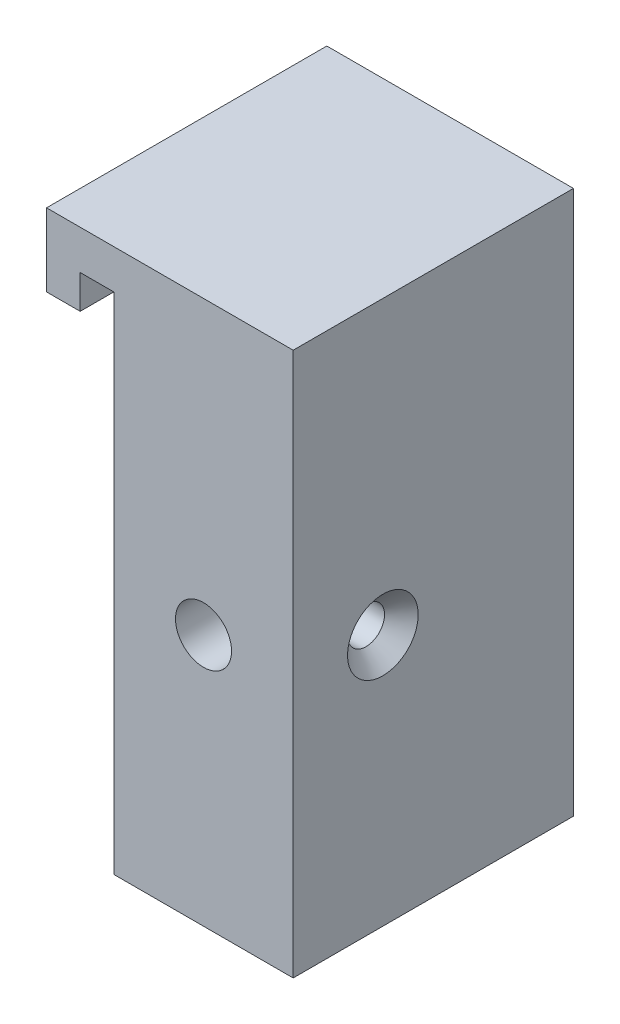
ISO-10303-21;
HEADER;
FILE_DESCRIPTION(('STEP AP214'),'2;1');
FILE_NAME('part.step','',(''),(''),'','','');
FILE_SCHEMA(('AUTOMOTIVE_DESIGN { 1 0 10303 214 1 1 1 1 }'));
ENDSEC;
DATA;
#1=APPLICATION_CONTEXT('core data for automotive mechanical design processes');
#2=APPLICATION_PROTOCOL_DEFINITION('international standard','automotive_design',2000,#1);
#3=PRODUCT_CONTEXT('',#1,'mechanical');
#4=PRODUCT('Part','Part','',(#3));
#5=PRODUCT_RELATED_PRODUCT_CATEGORY('part','',(#4));
#6=PRODUCT_DEFINITION_FORMATION('','',#4);
#7=PRODUCT_DEFINITION_CONTEXT('part definition',#1,'design');
#8=PRODUCT_DEFINITION('design','',#6,#7);
#9=PRODUCT_DEFINITION_SHAPE('','',#8);
#10=(LENGTH_UNIT() NAMED_UNIT(*) SI_UNIT(.MILLI.,.METRE.));
#11=(NAMED_UNIT(*) PLANE_ANGLE_UNIT() SI_UNIT($,.RADIAN.));
#12=(NAMED_UNIT(*) SI_UNIT($,.STERADIAN.) SOLID_ANGLE_UNIT());
#13=UNCERTAINTY_MEASURE_WITH_UNIT(LENGTH_MEASURE(1.E-05),#10,'distance_accuracy_value','');
#14=(GEOMETRIC_REPRESENTATION_CONTEXT(3) GLOBAL_UNCERTAINTY_ASSIGNED_CONTEXT((#13)) GLOBAL_UNIT_ASSIGNED_CONTEXT((#10,
#11,#12)) REPRESENTATION_CONTEXT('',''));
#15=CARTESIAN_POINT('',(0.,0.,0.));
#16=DIRECTION('',(0.,0.,1.));
#17=DIRECTION('',(1.,0.,0.));
#18=AXIS2_PLACEMENT_3D('',#15,#16,#17);
#19=CARTESIAN_POINT('',(-32.,0.,25.));
#20=DIRECTION('',(0.,1.,0.));
#21=DIRECTION('',(0.,0.,1.));
#22=AXIS2_PLACEMENT_3D('',#19,#20,#21);
#23=PLANE('',#22);
#24=CARTESIAN_POINT('',(-7.,0.,0.));
#25=DIRECTION('',(0.,-1.,0.));
#26=DIRECTION('',(0.,0.,-1.));
#27=AXIS2_PLACEMENT_3D('',#24,#25,#26);
#28=CIRCLE('',#27,3.4);
#29=CARTESIAN_POINT('',(-7.,0.,-3.4));
#30=VERTEX_POINT('',#29);
#31=EDGE_CURVE('E232',#30,#30,#28,.T.);
#32=ORIENTED_EDGE('',*,*,#31,.F.);
#33=EDGE_LOOP('',(#32));
#34=FACE_BOUND('',#33,.T.);
#35=CARTESIAN_POINT('',(-25.,0.,0.));
#36=DIRECTION('',(0.,-1.,0.));
#37=DIRECTION('',(0.,0.,-1.));
#38=AXIS2_PLACEMENT_3D('',#35,#36,#37);
#39=CIRCLE('',#38,3.4);
#40=CARTESIAN_POINT('',(-25.,0.,-3.4));
#41=VERTEX_POINT('',#40);
#42=EDGE_CURVE('E224',#41,#41,#39,.T.);
#43=ORIENTED_EDGE('',*,*,#42,.F.);
#44=EDGE_LOOP('',(#43));
#45=FACE_BOUND('',#44,.T.);
#46=DIRECTION('',(1.,0.,0.));
#47=VECTOR('',#46,1.);
#48=CARTESIAN_POINT('',(-32.,0.,-25.));
#49=LINE('',#48,#47);
#50=CARTESIAN_POINT('',(-32.,0.,-25.));
#51=VERTEX_POINT('',#50);
#52=CARTESIAN_POINT('',(0.,0.,-25.));
#53=VERTEX_POINT('',#52);
#54=EDGE_CURVE('E146',#51,#53,#49,.T.);
#55=ORIENTED_EDGE('',*,*,#54,.T.);
#56=DIRECTION('',(0.,0.,-1.));
#57=VECTOR('',#56,1.);
#58=CARTESIAN_POINT('',(0.,0.,25.));
#59=LINE('',#58,#57);
#60=CARTESIAN_POINT('',(0.,0.,25.));
#61=VERTEX_POINT('',#60);
#62=EDGE_CURVE('E11',#61,#53,#59,.T.);
#63=ORIENTED_EDGE('',*,*,#62,.F.);
#64=DIRECTION('',(1.,0.,0.));
#65=VECTOR('',#64,1.);
#66=CARTESIAN_POINT('',(-32.,0.,25.));
#67=LINE('',#66,#65);
#68=CARTESIAN_POINT('',(-32.,0.,25.));
#69=VERTEX_POINT('',#68);
#70=EDGE_CURVE('E169',#69,#61,#67,.T.);
#71=ORIENTED_EDGE('',*,*,#70,.F.);
#72=DIRECTION('',(0.,0.,-1.));
#73=VECTOR('',#72,1.);
#74=CARTESIAN_POINT('',(-32.,0.,25.));
#75=LINE('',#74,#73);
#76=EDGE_CURVE('E142',#69,#51,#75,.T.);
#77=ORIENTED_EDGE('',*,*,#76,.T.);
#78=EDGE_LOOP('',(#55,#63,#71,#77));
#79=FACE_BOUND('',#78,.T.);
#80=ADVANCED_FACE('F45',(#34,#45,#79),#23,.F.);
#81=CARTESIAN_POINT('',(0.,0.,25.));
#82=DIRECTION('',(-1.,0.,0.));
#83=DIRECTION('',(0.,0.,1.));
#84=AXIS2_PLACEMENT_3D('',#81,#82,#83);
#85=PLANE('',#84);
#86=CARTESIAN_POINT('',(0.,45.,9.));
#87=DIRECTION('',(1.,0.,0.));
#88=DIRECTION('',(0.,0.,-1.));
#89=AXIS2_PLACEMENT_3D('',#86,#87,#88);
#90=CIRCLE('',#89,6.3);
#91=CARTESIAN_POINT('',(0.,45.,2.7));
#92=VERTEX_POINT('',#91);
#93=EDGE_CURVE('E463',#92,#92,#90,.T.);
#94=ORIENTED_EDGE('',*,*,#93,.F.);
#95=EDGE_LOOP('',(#94));
#96=FACE_BOUND('',#95,.T.);
#97=DIRECTION('',(0.,1.,0.));
#98=VECTOR('',#97,1.);
#99=CARTESIAN_POINT('',(0.,0.,-25.));
#100=LINE('',#99,#98);
#101=CARTESIAN_POINT('',(0.,97.,-25.));
#102=VERTEX_POINT('',#101);
#103=EDGE_CURVE('E150',#53,#102,#100,.T.);
#104=ORIENTED_EDGE('',*,*,#103,.T.);
#105=DIRECTION('',(0.,0.,-1.));
#106=VECTOR('',#105,1.);
#107=CARTESIAN_POINT('',(0.,97.,25.));
#108=LINE('',#107,#106);
#109=CARTESIAN_POINT('',(0.,97.,25.));
#110=VERTEX_POINT('',#109);
#111=EDGE_CURVE('E54',#110,#102,#108,.T.);
#112=ORIENTED_EDGE('',*,*,#111,.F.);
#113=DIRECTION('',(0.,1.,0.));
#114=VECTOR('',#113,1.);
#115=CARTESIAN_POINT('',(0.,0.,25.));
#116=LINE('',#115,#114);
#117=EDGE_CURVE('E105',#61,#110,#116,.T.);
#118=ORIENTED_EDGE('',*,*,#117,.F.);
#119=ORIENTED_EDGE('',*,*,#62,.T.);
#120=EDGE_LOOP('',(#104,#112,#118,#119));
#121=FACE_BOUND('',#120,.T.);
#122=ADVANCED_FACE('F263',(#96,#121),#85,.F.);
#123=CARTESIAN_POINT('',(0.,97.,25.));
#124=DIRECTION('',(0.,-1.,0.));
#125=DIRECTION('',(0.,0.,-1.));
#126=AXIS2_PLACEMENT_3D('',#123,#124,#125);
#127=PLANE('',#126);
#128=DIRECTION('',(-1.,0.,0.));
#129=VECTOR('',#128,1.);
#130=CARTESIAN_POINT('',(0.,97.,-25.));
#131=LINE('',#130,#129);
#132=CARTESIAN_POINT('',(-44.,97.,-25.));
#133=VERTEX_POINT('',#132);
#134=EDGE_CURVE('E154',#102,#133,#131,.T.);
#135=ORIENTED_EDGE('',*,*,#134,.T.);
#136=DIRECTION('',(0.,0.,-1.));
#137=VECTOR('',#136,1.);
#138=CARTESIAN_POINT('',(-44.,97.,25.));
#139=LINE('',#138,#137);
#140=CARTESIAN_POINT('',(-44.,97.,25.));
#141=VERTEX_POINT('',#140);
#142=EDGE_CURVE('E180',#141,#133,#139,.T.);
#143=ORIENTED_EDGE('',*,*,#142,.F.);
#144=DIRECTION('',(-1.,0.,0.));
#145=VECTOR('',#144,1.);
#146=CARTESIAN_POINT('',(0.,97.,25.));
#147=LINE('',#146,#145);
#148=EDGE_CURVE('E190',#110,#141,#147,.T.);
#149=ORIENTED_EDGE('',*,*,#148,.F.);
#150=ORIENTED_EDGE('',*,*,#111,.T.);
#151=EDGE_LOOP('',(#135,#143,#149,#150));
#152=FACE_BOUND('',#151,.T.);
#153=ADVANCED_FACE('F188',(#152),#127,.F.);
#154=CARTESIAN_POINT('',(-44.,97.,25.));
#155=DIRECTION('',(1.,0.,0.));
#156=DIRECTION('',(0.,0.,-1.));
#157=AXIS2_PLACEMENT_3D('',#154,#155,#156);
#158=PLANE('',#157);
#159=DIRECTION('',(0.,-1.,0.));
#160=VECTOR('',#159,1.);
#161=CARTESIAN_POINT('',(-44.,97.,-25.));
#162=LINE('',#161,#160);
#163=CARTESIAN_POINT('',(-44.,84.,-25.));
#164=VERTEX_POINT('',#163);
#165=EDGE_CURVE('E157',#133,#164,#162,.T.);
#166=ORIENTED_EDGE('',*,*,#165,.T.);
#167=DIRECTION('',(0.,0.,-1.));
#168=VECTOR('',#167,1.);
#169=CARTESIAN_POINT('',(-44.,84.,25.));
#170=LINE('',#169,#168);
#171=CARTESIAN_POINT('',(-44.,84.,25.));
#172=VERTEX_POINT('',#171);
#173=EDGE_CURVE('E176',#172,#164,#170,.T.);
#174=ORIENTED_EDGE('',*,*,#173,.F.);
#175=DIRECTION('',(0.,-1.,0.));
#176=VECTOR('',#175,1.);
#177=CARTESIAN_POINT('',(-44.,97.,25.));
#178=LINE('',#177,#176);
#179=EDGE_CURVE('E203',#141,#172,#178,.T.);
#180=ORIENTED_EDGE('',*,*,#179,.F.);
#181=ORIENTED_EDGE('',*,*,#142,.T.);
#182=EDGE_LOOP('',(#166,#174,#180,#181));
#183=FACE_BOUND('',#182,.T.);
#184=ADVANCED_FACE('F198',(#183),#158,.F.);
#185=CARTESIAN_POINT('',(-44.,84.,25.));
#186=DIRECTION('',(0.,1.,0.));
#187=DIRECTION('',(0.,0.,1.));
#188=AXIS2_PLACEMENT_3D('',#185,#186,#187);
#189=PLANE('',#188);
#190=DIRECTION('',(1.,0.,0.));
#191=VECTOR('',#190,1.);
#192=CARTESIAN_POINT('',(-44.,84.,-25.));
#193=LINE('',#192,#191);
#194=CARTESIAN_POINT('',(-38.,84.,-25.));
#195=VERTEX_POINT('',#194);
#196=EDGE_CURVE('E160',#164,#195,#193,.T.);
#197=ORIENTED_EDGE('',*,*,#196,.T.);
#198=DIRECTION('',(0.,0.,-1.));
#199=VECTOR('',#198,1.);
#200=CARTESIAN_POINT('',(-38.,84.,25.));
#201=LINE('',#200,#199);
#202=CARTESIAN_POINT('',(-38.,84.,25.));
#203=VERTEX_POINT('',#202);
#204=EDGE_CURVE('E135',#203,#195,#201,.T.);
#205=ORIENTED_EDGE('',*,*,#204,.F.);
#206=DIRECTION('',(1.,0.,0.));
#207=VECTOR('',#206,1.);
#208=CARTESIAN_POINT('',(-44.,84.,25.));
#209=LINE('',#208,#207);
#210=EDGE_CURVE('E124',#172,#203,#209,.T.);
#211=ORIENTED_EDGE('',*,*,#210,.F.);
#212=ORIENTED_EDGE('',*,*,#173,.T.);
#213=EDGE_LOOP('',(#197,#205,#211,#212));
#214=FACE_BOUND('',#213,.T.);
#215=ADVANCED_FACE('F201',(#214),#189,.F.);
#216=CARTESIAN_POINT('',(-38.,84.,25.));
#217=DIRECTION('',(-1.,0.,0.));
#218=DIRECTION('',(0.,0.,1.));
#219=AXIS2_PLACEMENT_3D('',#216,#217,#218);
#220=PLANE('',#219);
#221=DIRECTION('',(0.,1.,0.));
#222=VECTOR('',#221,1.);
#223=CARTESIAN_POINT('',(-38.,84.,-25.));
#224=LINE('',#223,#222);
#225=CARTESIAN_POINT('',(-38.,90.,-25.));
#226=VERTEX_POINT('',#225);
#227=EDGE_CURVE('E133',#195,#226,#224,.T.);
#228=ORIENTED_EDGE('',*,*,#227,.T.);
#229=DIRECTION('',(0.,0.,-1.));
#230=VECTOR('',#229,1.);
#231=CARTESIAN_POINT('',(-38.,90.,25.));
#232=LINE('',#231,#230);
#233=CARTESIAN_POINT('',(-38.,90.,25.));
#234=VERTEX_POINT('',#233);
#235=EDGE_CURVE('E130',#234,#226,#232,.T.);
#236=ORIENTED_EDGE('',*,*,#235,.F.);
#237=DIRECTION('',(0.,1.,0.));
#238=VECTOR('',#237,1.);
#239=CARTESIAN_POINT('',(-38.,84.,25.));
#240=LINE('',#239,#238);
#241=EDGE_CURVE('E118',#203,#234,#240,.T.);
#242=ORIENTED_EDGE('',*,*,#241,.F.);
#243=ORIENTED_EDGE('',*,*,#204,.T.);
#244=EDGE_LOOP('',(#228,#236,#242,#243));
#245=FACE_BOUND('',#244,.T.);
#246=ADVANCED_FACE('F131',(#245),#220,.F.);
#247=CARTESIAN_POINT('',(-38.,90.,25.));
#248=DIRECTION('',(0.,1.,0.));
#249=DIRECTION('',(0.,0.,1.));
#250=AXIS2_PLACEMENT_3D('',#247,#248,#249);
#251=PLANE('',#250);
#252=DIRECTION('',(1.,0.,0.));
#253=VECTOR('',#252,1.);
#254=CARTESIAN_POINT('',(-38.,90.,-25.));
#255=LINE('',#254,#253);
#256=CARTESIAN_POINT('',(-32.,90.,-25.));
#257=VERTEX_POINT('',#256);
#258=EDGE_CURVE('E91',#226,#257,#255,.T.);
#259=ORIENTED_EDGE('',*,*,#258,.T.);
#260=DIRECTION('',(0.,0.,-1.));
#261=VECTOR('',#260,1.);
#262=CARTESIAN_POINT('',(-32.,90.,25.));
#263=LINE('',#262,#261);
#264=CARTESIAN_POINT('',(-32.,90.,25.));
#265=VERTEX_POINT('',#264);
#266=EDGE_CURVE('E136',#265,#257,#263,.T.);
#267=ORIENTED_EDGE('',*,*,#266,.F.);
#268=DIRECTION('',(1.,0.,0.));
#269=VECTOR('',#268,1.);
#270=CARTESIAN_POINT('',(-38.,90.,25.));
#271=LINE('',#270,#269);
#272=EDGE_CURVE('E122',#234,#265,#271,.T.);
#273=ORIENTED_EDGE('',*,*,#272,.F.);
#274=ORIENTED_EDGE('',*,*,#235,.T.);
#275=EDGE_LOOP('',(#259,#267,#273,#274));
#276=FACE_BOUND('',#275,.T.);
#277=ADVANCED_FACE('F138',(#276),#251,.F.);
#278=CARTESIAN_POINT('',(-32.,90.,25.));
#279=DIRECTION('',(1.,0.,0.));
#280=DIRECTION('',(0.,0.,-1.));
#281=AXIS2_PLACEMENT_3D('',#278,#279,#280);
#282=PLANE('',#281);
#283=DIRECTION('',(0.,-1.,0.));
#284=VECTOR('',#283,1.);
#285=CARTESIAN_POINT('',(-32.,90.,-25.));
#286=LINE('',#285,#284);
#287=EDGE_CURVE('E97',#257,#51,#286,.T.);
#288=ORIENTED_EDGE('',*,*,#287,.T.);
#289=ORIENTED_EDGE('',*,*,#76,.F.);
#290=DIRECTION('',(0.,-1.,0.));
#291=VECTOR('',#290,1.);
#292=CARTESIAN_POINT('',(-32.,90.,25.));
#293=LINE('',#292,#291);
#294=EDGE_CURVE('E62',#265,#69,#293,.T.);
#295=ORIENTED_EDGE('',*,*,#294,.F.);
#296=ORIENTED_EDGE('',*,*,#266,.T.);
#297=EDGE_LOOP('',(#288,#289,#295,#296));
#298=FACE_BOUND('',#297,.T.);
#299=ADVANCED_FACE('F275',(#298),#282,.F.);
#300=CARTESIAN_POINT('',(0.,0.,25.));
#301=DIRECTION('',(0.,0.,1.));
#302=DIRECTION('',(1.,0.,0.));
#303=AXIS2_PLACEMENT_3D('',#300,#301,#302);
#304=PLANE('',#303);
#305=CARTESIAN_POINT('',(-16.,45.,25.));
#306=DIRECTION('',(0.,0.,1.));
#307=DIRECTION('',(1.,0.,0.));
#308=AXIS2_PLACEMENT_3D('',#305,#306,#307);
#309=CIRCLE('',#308,4.99999999999999);
#310=CARTESIAN_POINT('',(-11.,45.,25.));
#311=VERTEX_POINT('',#310);
#312=EDGE_CURVE('E216',#311,#311,#309,.T.);
#313=ORIENTED_EDGE('',*,*,#312,.F.);
#314=EDGE_LOOP('',(#313));
#315=FACE_BOUND('',#314,.T.);
#316=ORIENTED_EDGE('',*,*,#70,.T.);
#317=ORIENTED_EDGE('',*,*,#117,.T.);
#318=ORIENTED_EDGE('',*,*,#148,.T.);
#319=ORIENTED_EDGE('',*,*,#179,.T.);
#320=ORIENTED_EDGE('',*,*,#210,.T.);
#321=ORIENTED_EDGE('',*,*,#241,.T.);
#322=ORIENTED_EDGE('',*,*,#272,.T.);
#323=ORIENTED_EDGE('',*,*,#294,.T.);
#324=EDGE_LOOP('',(#316,#317,#318,#319,#320,#321,#322,#323));
#325=FACE_BOUND('',#324,.T.);
#326=ADVANCED_FACE('F120',(#315,#325),#304,.T.);
#327=CARTESIAN_POINT('',(0.,0.,-25.));
#328=DIRECTION('',(0.,0.,1.));
#329=DIRECTION('',(1.,0.,0.));
#330=AXIS2_PLACEMENT_3D('',#327,#328,#329);
#331=PLANE('',#330);
#332=ORIENTED_EDGE('',*,*,#54,.F.);
#333=ORIENTED_EDGE('',*,*,#287,.F.);
#334=ORIENTED_EDGE('',*,*,#258,.F.);
#335=ORIENTED_EDGE('',*,*,#227,.F.);
#336=ORIENTED_EDGE('',*,*,#196,.F.);
#337=ORIENTED_EDGE('',*,*,#165,.F.);
#338=ORIENTED_EDGE('',*,*,#134,.F.);
#339=ORIENTED_EDGE('',*,*,#103,.F.);
#340=EDGE_LOOP('',(#332,#333,#334,#335,#336,#337,#338,#339));
#341=FACE_BOUND('',#340,.T.);
#342=ADVANCED_FACE('F194',(#341),#331,.F.);
#343=CARTESIAN_POINT('',(-16.,45.,0.));
#344=DIRECTION('',(0.,0.,-1.));
#345=DIRECTION('',(-1.,0.,0.));
#346=AXIS2_PLACEMENT_3D('',#343,#344,#345);
#347=PLANE('',#346);
#348=CARTESIAN_POINT('',(-16.,45.,0.));
#349=DIRECTION('',(0.,0.,1.));
#350=DIRECTION('',(1.,0.,0.));
#351=AXIS2_PLACEMENT_3D('',#348,#349,#350);
#352=CIRCLE('',#351,5.);
#353=CARTESIAN_POINT('',(-11.,45.,0.));
#354=VERTEX_POINT('',#353);
#355=EDGE_CURVE('E151',#354,#354,#352,.T.);
#356=ORIENTED_EDGE('',*,*,#355,.T.);
#357=EDGE_LOOP('',(#356));
#358=FACE_BOUND('',#357,.T.);
#359=ADVANCED_FACE('F330',(#358),#347,.F.);
#360=CARTESIAN_POINT('',(-16.,45.,25.));
#361=DIRECTION('',(0.,0.,1.));
#362=DIRECTION('',(1.,0.,0.));
#363=AXIS2_PLACEMENT_3D('',#360,#361,#362);
#364=CYLINDRICAL_SURFACE('',#363,4.99999999999999);
#365=CARTESIAN_POINT('',(-11.,45.,5.7));
#366=CARTESIAN_POINT('',(-11.0000049797154,45.1661087100987,5.70000563881154));
#367=CARTESIAN_POINT('',(-11.0083524634531,45.3322524989141,5.7126141749076));
#368=CARTESIAN_POINT('',(-11.0409234694194,45.6592567617237,5.76228740100713));
#369=CARTESIAN_POINT('',(-11.0651567672503,45.8201139184527,5.79936714987673));
#370=CARTESIAN_POINT('',(-11.1270986084443,46.1313331561117,5.89572565911595));
#371=CARTESIAN_POINT('',(-11.1647438439377,46.2817406424397,5.95490018829852));
#372=CARTESIAN_POINT('',(-11.2504695616458,46.5699020330071,6.09294607884066));
#373=CARTESIAN_POINT('',(-11.2985514060137,46.7076542821815,6.17182001150683));
#374=CARTESIAN_POINT('',(-11.4060867911775,46.979673696901,6.35426097362401));
#375=CARTESIAN_POINT('',(-11.4661566282803,47.1126733871233,6.45934686831311));
#376=CARTESIAN_POINT('',(-11.5900230834179,47.3603657120324,6.68762095320567));
#377=CARTESIAN_POINT('',(-11.6538248966216,47.4750319550074,6.81083475826332));
#378=CARTESIAN_POINT('',(-11.7898643082952,47.7008629807824,7.0939492140042));
#379=CARTESIAN_POINT('',(-11.8618864748207,47.8087642040079,7.25657733864784));
#380=CARTESIAN_POINT('',(-11.995014962994,47.9955398648891,7.60175833309369));
#381=CARTESIAN_POINT('',(-12.0561400699281,48.0744645087173,7.78427602269469));
#382=CARTESIAN_POINT('',(-12.1423199014631,48.1814498113181,8.11172878951611));
#383=CARTESIAN_POINT('',(-12.1726885920174,48.2175904716384,8.25261206169051));
#384=CARTESIAN_POINT('',(-12.2182831314955,48.2710679853448,8.54019629776967));
#385=CARTESIAN_POINT('',(-12.2335342900591,48.2884362716981,8.68688710898576));
#386=CARTESIAN_POINT('',(-12.2465449744928,48.3032852247162,8.98264665166635));
#387=CARTESIAN_POINT('',(-12.2442377287774,48.3006899730821,9.13172230697425));
#388=CARTESIAN_POINT('',(-12.2223621152483,48.2756222186249,9.42695292340378));
#389=CARTESIAN_POINT('',(-12.2027791676102,48.2531329261869,9.57310531086286));
#390=CARTESIAN_POINT('',(-12.1504570753132,48.1910124970141,9.85273517754464));
#391=CARTESIAN_POINT('',(-12.1182797607473,48.1521084836889,9.98648608064626));
#392=CARTESIAN_POINT('',(-12.0444598389076,48.0589582049994,10.2456990825193));
#393=CARTESIAN_POINT('',(-12.0028141254295,48.0047069033715,10.3711584436942));
#394=CARTESIAN_POINT('',(-11.9046531058894,47.8699111884053,10.6370981864322));
#395=CARTESIAN_POINT('',(-11.8468317802024,47.7862730940456,10.775524579753));
#396=CARTESIAN_POINT('',(-11.7280363725581,47.6004841327672,11.0379838641635));
#397=CARTESIAN_POINT('',(-11.6670584944019,47.4983105864853,11.1619988134985));
#398=CARTESIAN_POINT('',(-11.5340948567937,47.2536335024306,11.4184083647856));
#399=CARTESIAN_POINT('',(-11.4624416177138,47.1071594582894,11.5472287368739));
#400=CARTESIAN_POINT('',(-11.3286179097636,46.7909702877268,11.7786124817198));
#401=CARTESIAN_POINT('',(-11.2664382167047,46.6212780779611,11.8812014623099));
#402=CARTESIAN_POINT('',(-11.168928367278,46.2974788525532,12.0384612597186));
#403=CARTESIAN_POINT('',(-11.1307217244945,46.1468928151785,12.0985914076143));
#404=CARTESIAN_POINT('',(-11.0678331707962,45.8359521027454,12.1965119370802));
#405=CARTESIAN_POINT('',(-11.0431399435349,45.6756057265899,12.234321012764));
#406=CARTESIAN_POINT('',(-11.0094619344049,45.3487335191435,12.2857042508974));
#407=CARTESIAN_POINT('',(-11.0005409947037,45.18218534702,12.2991799226505));
#408=CARTESIAN_POINT('',(-10.9995073484331,44.8489090457051,12.3007468299301));
#409=CARTESIAN_POINT('',(-11.0073940861588,44.6821809226455,12.2888389047035));
#410=CARTESIAN_POINT('',(-11.0381144739819,44.3648180098666,12.2420035404811));
#411=CARTESIAN_POINT('',(-11.0599303704839,44.2138461881654,12.2086424963732));
#412=CARTESIAN_POINT('',(-11.115716364273,43.9201198017955,12.1220697131047));
#413=CARTESIAN_POINT('',(-11.149688413659,43.7773665611864,12.0688547856446));
#414=CARTESIAN_POINT('',(-11.2298142207509,43.4938761988668,11.940636026081));
#415=CARTESIAN_POINT('',(-11.2766112254084,43.3538600219115,11.8644503801412));
#416=CARTESIAN_POINT('',(-11.3777922471039,43.0880751119317,11.6943421553612));
#417=CARTESIAN_POINT('',(-11.4321812636818,42.9623158671781,11.6004078740449));
#418=CARTESIAN_POINT('',(-11.5538280129421,42.7077432255084,11.3807783916206));
#419=CARTESIAN_POINT('',(-11.6217646528427,42.5815574778501,11.2524116616523));
#420=CARTESIAN_POINT('',(-11.7570334586798,42.3514041365164,10.9766688555345));
#421=CARTESIAN_POINT('',(-11.8243652525539,42.2474494264298,10.8292818354255));
#422=CARTESIAN_POINT('',(-11.9450818895731,42.0729271989075,10.5325932013654));
#423=CARTESIAN_POINT('',(-11.9991878465187,42.0000669770535,10.3849409045406));
#424=CARTESIAN_POINT('',(-12.0950428186977,41.8763057404337,10.0770073618075));
#425=CARTESIAN_POINT('',(-12.1368141046753,41.8253650720246,9.9167495467197));
#426=CARTESIAN_POINT('',(-12.196134537061,41.7546360091226,9.61440287747852));
#427=CARTESIAN_POINT('',(-12.2165736459902,41.7310523388888,9.47378333949387));
#428=CARTESIAN_POINT('',(-12.2415625924058,41.702343443817,9.18932233689651));
#429=CARTESIAN_POINT('',(-12.2461276659184,41.6972005192559,9.04548409518438));
#430=CARTESIAN_POINT('',(-12.2386678946208,41.7057014647664,8.75881774896694));
#431=CARTESIAN_POINT('',(-12.2266424723678,41.7193459887472,8.61598967979526));
#432=CARTESIAN_POINT('',(-12.1878441499623,41.7645212077345,8.33519507026765));
#433=CARTESIAN_POINT('',(-12.1610517879487,41.7960755082945,8.19723520174039));
#434=CARTESIAN_POINT('',(-12.0871097750882,41.8865523633796,7.89165869428481));
#435=CARTESIAN_POINT('',(-12.036371775352,41.9506440086559,7.72645649367746));
#436=CARTESIAN_POINT('',(-11.9241661332735,42.1023357957535,7.41121035872069));
#437=CARTESIAN_POINT('',(-11.8626836254042,42.1899685992997,7.26118788634872));
#438=CARTESIAN_POINT('',(-11.7347037090171,42.3882138879942,6.97531592053781));
#439=CARTESIAN_POINT('',(-11.668138277504,42.4991953933869,6.83975428969386));
#440=CARTESIAN_POINT('',(-11.5368598966754,42.7418191193346,6.5872754380614));
#441=CARTESIAN_POINT('',(-11.4721474845825,42.8734672612163,6.4703635801509));
#442=CARTESIAN_POINT('',(-11.3766753568583,43.0941123541336,6.30416781907634));
#443=CARTESIAN_POINT('',(-11.3434197121207,43.176660583831,6.24763157721441));
#444=CARTESIAN_POINT('',(-11.2801161233333,43.3474338100589,6.14183545128243));
#445=CARTESIAN_POINT('',(-11.2500666482714,43.4356560645748,6.09257208991119));
#446=CARTESIAN_POINT('',(-11.1940790450875,43.6172015068521,6.00197690845561));
#447=CARTESIAN_POINT('',(-11.1681360445847,43.7105184700789,5.9606356762103));
#448=CARTESIAN_POINT('',(-11.1211445044182,43.9016105670623,5.88647294994931));
#449=CARTESIAN_POINT('',(-11.1000939727632,43.9993838669377,5.85364798785964));
#450=CARTESIAN_POINT('',(-11.0553188091737,44.2438667406585,5.78427636240847));
#451=CARTESIAN_POINT('',(-11.0347150137608,44.3926503680684,5.75279949242883));
#452=CARTESIAN_POINT('',(-11.0070569563001,44.6942809111282,5.71066430711762));
#453=CARTESIAN_POINT('',(-10.9999954170314,44.8471255996827,5.69999481044714));
#454=CARTESIAN_POINT('',(-11.,45.,5.7));
#455=B_SPLINE_CURVE_WITH_KNOTS('',3,(#365,#366,#367,#368,#369,#370,#371,#372,#373,#374,#375,
#376,#377,#378,#379,#380,#381,#382,#383,#384,#385,#386,#387,#388,#389,#390,#391,#392,#393,#394,
#395,#396,#397,#398,#399,#400,#401,#402,#403,#404,#405,#406,#407,#408,#409,#410,#411,#412,#413,
#414,#415,#416,#417,#418,#419,#420,#421,#422,#423,#424,#425,#426,#427,#428,#429,#430,#431,#432,
#433,#434,#435,#436,#437,#438,#439,#440,#441,#442,#443,#444,#445,#446,#447,#448,#449,#450,#451,
#452,#453,#454),.UNSPECIFIED.,.T.,.F.,(4,2,2,2,2,2,2,2,2,2,2,2,2,2,2,2,2,2,2,2,2,2,2,2,2,2,2,2,
2,2,2,2,2,2,2,2,2,2,2,2,2,2,2,2,4),(0.,0.497726346438328,0.995759265011474,1.49147182327556,
1.98724911932336,2.52472285398069,3.06296346909751,3.68416119442295,4.30427746662549,
4.74824206332347,5.19146211660388,5.63636849926013,6.0816507201402,6.50899317832884,
6.93647603335878,7.44993759598858,7.96403170330015,8.58448225944135,9.20432478137938,
9.70198972827775,10.1992372825104,10.6984929984064,11.1977322078819,11.6641183533543,
12.1305794272009,12.627059041866,13.1238671575371,13.6987737764681,14.2740126744385,
14.7920218070748,15.3090898529516,15.7393109775655,16.1691190583515,16.5989420992603,
17.0293329781066,17.5793444324805,18.130122966495,18.6903664780719,19.2507708024659,
19.5666924494275,19.8824625556849,20.1978551421486,20.5131190892221,20.9714366484685,
21.4295078518911),.UNSPECIFIED.);
#456=CARTESIAN_POINT('',(-11.,45.,5.7));
#457=VERTEX_POINT('',#456);
#458=EDGE_CURVE('E236',#457,#457,#455,.T.);
#459=ORIENTED_EDGE('',*,*,#458,.T.);
#460=EDGE_LOOP('',(#459));
#461=FACE_BOUND('',#460,.T.);
#462=ORIENTED_EDGE('',*,*,#355,.F.);
#463=EDGE_LOOP('',(#462));
#464=FACE_BOUND('',#463,.T.);
#465=ORIENTED_EDGE('',*,*,#312,.T.);
#466=EDGE_LOOP('',(#465));
#467=FACE_BOUND('',#466,.T.);
#468=ADVANCED_FACE('F344',(#461,#464,#467),#364,.F.);
#469=CARTESIAN_POINT('',(-25.,15.,0.));
#470=DIRECTION('',(0.,1.,0.));
#471=DIRECTION('',(0.,0.,1.));
#472=AXIS2_PLACEMENT_3D('',#469,#470,#471);
#473=PLANE('',#472);
#474=CARTESIAN_POINT('',(-25.,15.,0.));
#475=DIRECTION('',(0.,-1.,0.));
#476=DIRECTION('',(0.,0.,-1.));
#477=AXIS2_PLACEMENT_3D('',#474,#475,#476);
#478=CIRCLE('',#477,3.4);
#479=CARTESIAN_POINT('',(-25.,15.,-3.4));
#480=VERTEX_POINT('',#479);
#481=EDGE_CURVE('E220',#480,#480,#478,.T.);
#482=ORIENTED_EDGE('',*,*,#481,.T.);
#483=EDGE_LOOP('',(#482));
#484=FACE_BOUND('',#483,.T.);
#485=ADVANCED_FACE('F360',(#484),#473,.F.);
#486=CARTESIAN_POINT('',(-25.,0.,0.));
#487=DIRECTION('',(0.,-1.,0.));
#488=DIRECTION('',(0.,0.,-1.));
#489=AXIS2_PLACEMENT_3D('',#486,#487,#488);
#490=CYLINDRICAL_SURFACE('',#489,3.4);
#491=ORIENTED_EDGE('',*,*,#481,.F.);
#492=EDGE_LOOP('',(#491));
#493=FACE_BOUND('',#492,.T.);
#494=ORIENTED_EDGE('',*,*,#42,.T.);
#495=EDGE_LOOP('',(#494));
#496=FACE_BOUND('',#495,.T.);
#497=ADVANCED_FACE('F365',(#493,#496),#490,.F.);
#498=CARTESIAN_POINT('',(-7.,15.,0.));
#499=DIRECTION('',(0.,1.,0.));
#500=DIRECTION('',(0.,0.,1.));
#501=AXIS2_PLACEMENT_3D('',#498,#499,#500);
#502=PLANE('',#501);
#503=CARTESIAN_POINT('',(-7.,15.,0.));
#504=DIRECTION('',(0.,-1.,0.));
#505=DIRECTION('',(0.,0.,-1.));
#506=AXIS2_PLACEMENT_3D('',#503,#504,#505);
#507=CIRCLE('',#506,3.4);
#508=CARTESIAN_POINT('',(-7.,15.,-3.4));
#509=VERTEX_POINT('',#508);
#510=EDGE_CURVE('E228',#509,#509,#507,.T.);
#511=ORIENTED_EDGE('',*,*,#510,.T.);
#512=EDGE_LOOP('',(#511));
#513=FACE_BOUND('',#512,.T.);
#514=ADVANCED_FACE('F376',(#513),#502,.F.);
#515=CARTESIAN_POINT('',(-7.,0.,0.));
#516=DIRECTION('',(0.,-1.,0.));
#517=DIRECTION('',(0.,0.,-1.));
#518=AXIS2_PLACEMENT_3D('',#515,#516,#517);
#519=CYLINDRICAL_SURFACE('',#518,3.4);
#520=ORIENTED_EDGE('',*,*,#510,.F.);
#521=EDGE_LOOP('',(#520));
#522=FACE_BOUND('',#521,.T.);
#523=ORIENTED_EDGE('',*,*,#31,.T.);
#524=EDGE_LOOP('',(#523));
#525=FACE_BOUND('',#524,.T.);
#526=ADVANCED_FACE('F254',(#522,#525),#519,.F.);
#527=CARTESIAN_POINT('',(0.,45.,9.));
#528=DIRECTION('',(1.,0.,0.));
#529=DIRECTION('',(0.,0.,-1.));
#530=AXIS2_PLACEMENT_3D('',#527,#528,#529);
#531=CYLINDRICAL_SURFACE('',#530,3.3);
#532=ORIENTED_EDGE('',*,*,#458,.F.);
#533=EDGE_LOOP('',(#532));
#534=FACE_BOUND('',#533,.T.);
#535=CARTESIAN_POINT('',(-3.,45.,9.));
#536=DIRECTION('',(1.,0.,0.));
#537=DIRECTION('',(0.,0.,-1.));
#538=AXIS2_PLACEMENT_3D('',#535,#536,#537);
#539=CIRCLE('',#538,3.3);
#540=CARTESIAN_POINT('',(-3.,45.,5.7));
#541=VERTEX_POINT('',#540);
#542=EDGE_CURVE('E245',#541,#541,#539,.T.);
#543=ORIENTED_EDGE('',*,*,#542,.T.);
#544=EDGE_LOOP('',(#543));
#545=FACE_BOUND('',#544,.T.);
#546=ADVANCED_FACE('F249',(#534,#545),#531,.F.);
#547=CARTESIAN_POINT('',(0.,45.,9.));
#548=DIRECTION('',(1.,0.,0.));
#549=DIRECTION('',(0.,0.,-1.));
#550=AXIS2_PLACEMENT_3D('',#547,#548,#549);
#551=CONICAL_SURFACE('',#550,6.3,0.785398163397449);
#552=ORIENTED_EDGE('',*,*,#542,.F.);
#553=EDGE_LOOP('',(#552));
#554=FACE_BOUND('',#553,.T.);
#555=ORIENTED_EDGE('',*,*,#93,.T.);
#556=EDGE_LOOP('',(#555));
#557=FACE_BOUND('',#556,.T.);
#558=ADVANCED_FACE('F253',(#554,#557),#551,.F.);
#559=CLOSED_SHELL('',(#80,#122,#153,#184,#215,#246,#277,#299,#326,#342,#359,#468,#485,#497,#514,
#526,#546,#558));
#560=MANIFOLD_SOLID_BREP('B2',#559);
#561=ADVANCED_BREP_SHAPE_REPRESENTATION('',(#18,#560),#14);
#562=SHAPE_DEFINITION_REPRESENTATION(#9,#561);
ENDSEC;
END-ISO-10303-21;
